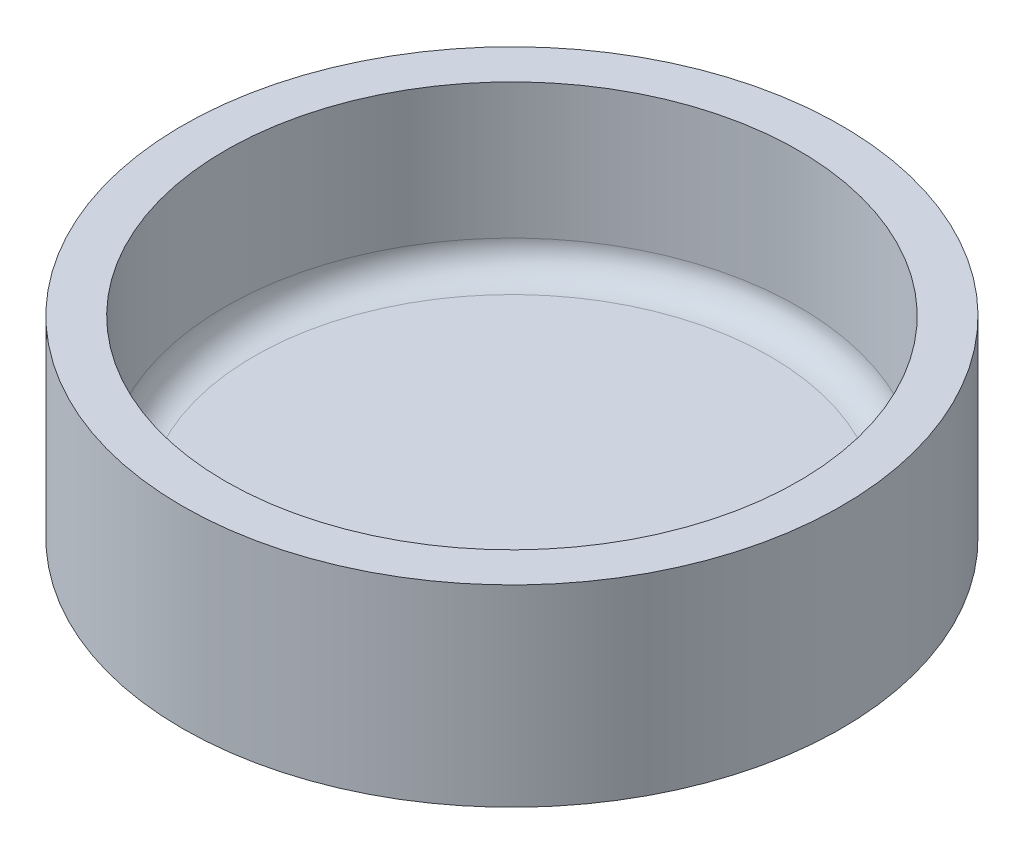
ISO-10303-21;
HEADER;
FILE_DESCRIPTION(('STEP AP214'),'2;1');
FILE_NAME('part.step','',(''),(''),'','','');
FILE_SCHEMA(('AUTOMOTIVE_DESIGN { 1 0 10303 214 1 1 1 1 }'));
ENDSEC;
DATA;
#1=APPLICATION_CONTEXT('core data for automotive mechanical design processes');
#2=APPLICATION_PROTOCOL_DEFINITION('international standard','automotive_design',2000,#1);
#3=PRODUCT_CONTEXT('',#1,'mechanical');
#4=PRODUCT('Part','Part','',(#3));
#5=PRODUCT_RELATED_PRODUCT_CATEGORY('part','',(#4));
#6=PRODUCT_DEFINITION_FORMATION('','',#4);
#7=PRODUCT_DEFINITION_CONTEXT('part definition',#1,'design');
#8=PRODUCT_DEFINITION('design','',#6,#7);
#9=PRODUCT_DEFINITION_SHAPE('','',#8);
#10=(LENGTH_UNIT() NAMED_UNIT(*) SI_UNIT(.MILLI.,.METRE.));
#11=(NAMED_UNIT(*) PLANE_ANGLE_UNIT() SI_UNIT($,.RADIAN.));
#12=(NAMED_UNIT(*) SI_UNIT($,.STERADIAN.) SOLID_ANGLE_UNIT());
#13=UNCERTAINTY_MEASURE_WITH_UNIT(LENGTH_MEASURE(1.E-05),#10,'distance_accuracy_value','');
#14=(GEOMETRIC_REPRESENTATION_CONTEXT(3) GLOBAL_UNCERTAINTY_ASSIGNED_CONTEXT((#13)) GLOBAL_UNIT_ASSIGNED_CONTEXT((#10,
#11,#12)) REPRESENTATION_CONTEXT('',''));
#15=CARTESIAN_POINT('',(0.,0.,0.));
#16=DIRECTION('',(0.,0.,1.));
#17=DIRECTION('',(1.,0.,0.));
#18=AXIS2_PLACEMENT_3D('',#15,#16,#17);
#19=CARTESIAN_POINT('',(0.,33.6,0.));
#20=DIRECTION('',(0.,-1.,0.));
#21=DIRECTION('',(0.,0.,-1.));
#22=AXIS2_PLACEMENT_3D('',#19,#20,#21);
#23=CYLINDRICAL_SURFACE('',#22,57.5);
#24=CARTESIAN_POINT('',(0.,33.6,0.));
#25=DIRECTION('',(0.,1.,0.));
#26=DIRECTION('',(0.,0.,1.));
#27=AXIS2_PLACEMENT_3D('',#24,#25,#26);
#28=CIRCLE('',#27,57.5);
#29=CARTESIAN_POINT('',(0.,33.6,57.5));
#30=VERTEX_POINT('',#29);
#31=EDGE_CURVE('E42',#30,#30,#28,.T.);
#32=ORIENTED_EDGE('',*,*,#31,.F.);
#33=EDGE_LOOP('',(#32));
#34=FACE_BOUND('',#33,.T.);
#35=CARTESIAN_POINT('',(0.,0.,0.));
#36=DIRECTION('',(0.,1.,0.));
#37=DIRECTION('',(0.,0.,1.));
#38=AXIS2_PLACEMENT_3D('',#35,#36,#37);
#39=CIRCLE('',#38,57.5);
#40=CARTESIAN_POINT('',(0.,0.,57.5));
#41=VERTEX_POINT('',#40);
#42=EDGE_CURVE('E46',#41,#41,#39,.T.);
#43=ORIENTED_EDGE('',*,*,#42,.T.);
#44=EDGE_LOOP('',(#43));
#45=FACE_BOUND('',#44,.T.);
#46=ADVANCED_FACE('F31',(#34,#45),#23,.T.);
#47=CARTESIAN_POINT('',(0.,33.6,0.));
#48=DIRECTION('',(0.,1.,0.));
#49=DIRECTION('',(0.,0.,1.));
#50=AXIS2_PLACEMENT_3D('',#47,#48,#49);
#51=PLANE('',#50);
#52=CARTESIAN_POINT('',(0.,33.6,0.));
#53=DIRECTION('',(0.,1.,0.));
#54=DIRECTION('',(0.,0.,1.));
#55=AXIS2_PLACEMENT_3D('',#52,#53,#54);
#56=CIRCLE('',#55,50.);
#57=CARTESIAN_POINT('',(0.,33.6,50.));
#58=VERTEX_POINT('',#57);
#59=EDGE_CURVE('E50',#58,#58,#56,.T.);
#60=ORIENTED_EDGE('',*,*,#59,.F.);
#61=EDGE_LOOP('',(#60));
#62=FACE_BOUND('',#61,.T.);
#63=ORIENTED_EDGE('',*,*,#31,.T.);
#64=EDGE_LOOP('',(#63));
#65=FACE_BOUND('',#64,.T.);
#66=ADVANCED_FACE('F57',(#62,#65),#51,.T.);
#67=CARTESIAN_POINT('',(0.,0.,0.));
#68=DIRECTION('',(0.,1.,0.));
#69=DIRECTION('',(0.,0.,1.));
#70=AXIS2_PLACEMENT_3D('',#67,#68,#69);
#71=PLANE('',#70);
#72=ORIENTED_EDGE('',*,*,#42,.F.);
#73=EDGE_LOOP('',(#72));
#74=FACE_BOUND('',#73,.T.);
#75=ADVANCED_FACE('F60',(#74),#71,.F.);
#76=CARTESIAN_POINT('',(0.,5.,0.));
#77=DIRECTION('',(0.,1.,0.));
#78=DIRECTION('',(0.,0.,1.));
#79=AXIS2_PLACEMENT_3D('',#76,#77,#78);
#80=CYLINDRICAL_SURFACE('',#79,50.);
#81=CARTESIAN_POINT('',(0.,10.,0.));
#82=DIRECTION('',(0.,1.,0.));
#83=DIRECTION('',(0.,0.,1.));
#84=AXIS2_PLACEMENT_3D('',#81,#82,#83);
#85=CIRCLE('',#84,50.);
#86=CARTESIAN_POINT('',(0.,10.,50.));
#87=VERTEX_POINT('',#86);
#88=EDGE_CURVE('E10',#87,#87,#85,.F.);
#89=ORIENTED_EDGE('',*,*,#88,.T.);
#90=EDGE_LOOP('',(#89));
#91=FACE_BOUND('',#90,.T.);
#92=ORIENTED_EDGE('',*,*,#59,.T.);
#93=EDGE_LOOP('',(#92));
#94=FACE_BOUND('',#93,.T.);
#95=ADVANCED_FACE('F55',(#91,#94),#80,.F.);
#96=CARTESIAN_POINT('',(0.,5.,0.));
#97=DIRECTION('',(0.,1.,0.));
#98=DIRECTION('',(0.,0.,1.));
#99=AXIS2_PLACEMENT_3D('',#96,#97,#98);
#100=PLANE('',#99);
#101=CARTESIAN_POINT('',(0.,5.,0.));
#102=DIRECTION('',(0.,1.,0.));
#103=DIRECTION('',(0.,0.,1.));
#104=AXIS2_PLACEMENT_3D('',#101,#102,#103);
#105=CIRCLE('',#104,45.);
#106=CARTESIAN_POINT('',(0.,5.,45.));
#107=VERTEX_POINT('',#106);
#108=EDGE_CURVE('E38',#107,#107,#105,.T.);
#109=ORIENTED_EDGE('',*,*,#108,.T.);
#110=EDGE_LOOP('',(#109));
#111=FACE_BOUND('',#110,.T.);
#112=ADVANCED_FACE('F73',(#111),#100,.T.);
#113=CARTESIAN_POINT('',(0.,10.,0.));
#114=DIRECTION('',(0.,1.,0.));
#115=DIRECTION('',(0.,0.,1.));
#116=AXIS2_PLACEMENT_3D('',#113,#114,#115);
#117=TOROIDAL_SURFACE('',#116,45.,5.);
#118=ORIENTED_EDGE('',*,*,#88,.F.);
#119=EDGE_LOOP('',(#118));
#120=FACE_BOUND('',#119,.T.);
#121=ORIENTED_EDGE('',*,*,#108,.F.);
#122=EDGE_LOOP('',(#121));
#123=FACE_BOUND('',#122,.T.);
#124=ADVANCED_FACE('F33',(#120,#123),#117,.F.);
#125=CLOSED_SHELL('',(#46,#66,#75,#95,#112,#124));
#126=MANIFOLD_SOLID_BREP('B2',#125);
#127=ADVANCED_BREP_SHAPE_REPRESENTATION('',(#18,#126),#14);
#128=SHAPE_DEFINITION_REPRESENTATION(#9,#127);
ENDSEC;
END-ISO-10303-21;
